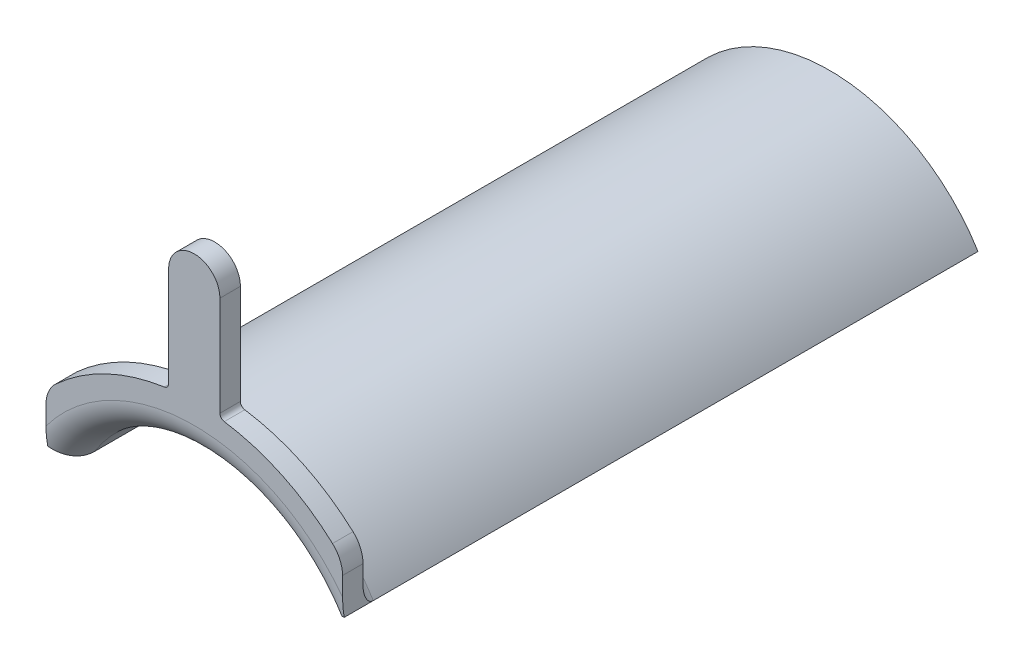
ISO-10303-21;
HEADER;
FILE_DESCRIPTION(('STEP AP214'),'2;1');
FILE_NAME('part.step','',(''),(''),'','','');
FILE_SCHEMA(('AUTOMOTIVE_DESIGN { 1 0 10303 214 1 1 1 1 }'));
ENDSEC;
DATA;
#1=APPLICATION_CONTEXT('core data for automotive mechanical design processes');
#2=APPLICATION_PROTOCOL_DEFINITION('international standard','automotive_design',2000,#1);
#3=PRODUCT_CONTEXT('',#1,'mechanical');
#4=PRODUCT('Part','Part','',(#3));
#5=PRODUCT_RELATED_PRODUCT_CATEGORY('part','',(#4));
#6=PRODUCT_DEFINITION_FORMATION('','',#4);
#7=PRODUCT_DEFINITION_CONTEXT('part definition',#1,'design');
#8=PRODUCT_DEFINITION('design','',#6,#7);
#9=PRODUCT_DEFINITION_SHAPE('','',#8);
#10=(LENGTH_UNIT() NAMED_UNIT(*) SI_UNIT(.MILLI.,.METRE.));
#11=(NAMED_UNIT(*) PLANE_ANGLE_UNIT() SI_UNIT($,.RADIAN.));
#12=(NAMED_UNIT(*) SI_UNIT($,.STERADIAN.) SOLID_ANGLE_UNIT());
#13=UNCERTAINTY_MEASURE_WITH_UNIT(LENGTH_MEASURE(1.E-05),#10,'distance_accuracy_value','');
#14=(GEOMETRIC_REPRESENTATION_CONTEXT(3) GLOBAL_UNCERTAINTY_ASSIGNED_CONTEXT((#13)) GLOBAL_UNIT_ASSIGNED_CONTEXT((#10,
#11,#12)) REPRESENTATION_CONTEXT('',''));
#15=CARTESIAN_POINT('',(0.,0.,0.));
#16=DIRECTION('',(0.,0.,1.));
#17=DIRECTION('',(1.,0.,0.));
#18=AXIS2_PLACEMENT_3D('',#15,#16,#17);
#19=CARTESIAN_POINT('',(0.,0.,6.2));
#20=DIRECTION('',(0.,0.,-1.));
#21=DIRECTION('',(-1.,0.,0.));
#22=AXIS2_PLACEMENT_3D('',#19,#20,#21);
#23=CYLINDRICAL_SURFACE('',#22,2.);
#24=CARTESIAN_POINT('',(0.,0.,6.));
#25=DIRECTION('',(0.,0.,1.));
#26=DIRECTION('',(1.,0.,0.));
#27=AXIS2_PLACEMENT_3D('',#24,#25,#26);
#28=CIRCLE('',#27,2.);
#29=CARTESIAN_POINT('',(-0.292682926829268,1.9784682722608,6.));
#30=VERTEX_POINT('',#29);
#31=CARTESIAN_POINT('',(-1.34894854738371,1.47659670069771,6.));
#32=VERTEX_POINT('',#31);
#33=EDGE_CURVE('E203',#30,#32,#28,.T.);
#34=ORIENTED_EDGE('',*,*,#33,.T.);
#35=DIRECTION('',(0.,0.,-1.));
#36=VECTOR('',#35,1.);
#37=CARTESIAN_POINT('',(-1.34894854738371,1.47659670069771,6.2));
#38=LINE('',#37,#36);
#39=CARTESIAN_POINT('',(-1.34894854738371,1.47659670069771,6.2));
#40=VERTEX_POINT('',#39);
#41=EDGE_CURVE('E372',#32,#40,#38,.F.);
#42=ORIENTED_EDGE('',*,*,#41,.T.);
#43=CARTESIAN_POINT('',(0.,0.,6.2));
#44=DIRECTION('',(0.,0.,1.));
#45=DIRECTION('',(1.,0.,0.));
#46=AXIS2_PLACEMENT_3D('',#43,#44,#45);
#47=CIRCLE('',#46,2.);
#48=CARTESIAN_POINT('',(-0.292682926829268,1.9784682722608,6.2));
#49=VERTEX_POINT('',#48);
#50=EDGE_CURVE('E195',#49,#40,#47,.T.);
#51=ORIENTED_EDGE('',*,*,#50,.F.);
#52=DIRECTION('',(0.,0.,-1.));
#53=VECTOR('',#52,1.);
#54=CARTESIAN_POINT('',(-0.292682926829268,1.9784682722608,6.2));
#55=LINE('',#54,#53);
#56=EDGE_CURVE('E237',#49,#30,#55,.T.);
#57=ORIENTED_EDGE('',*,*,#56,.T.);
#58=EDGE_LOOP('',(#34,#42,#51,#57));
#59=FACE_BOUND('',#58,.T.);
#60=ADVANCED_FACE('F37',(#59),#23,.T.);
#61=CARTESIAN_POINT('',(0.,0.,6.));
#62=DIRECTION('',(0.,0.,-1.));
#63=DIRECTION('',(-1.,0.,0.));
#64=AXIS2_PLACEMENT_3D('',#61,#62,#63);
#65=CYLINDRICAL_SURFACE('',#64,1.5);
#66=DIRECTION('',(0.,0.,-1.));
#67=VECTOR('',#66,1.);
#68=CARTESIAN_POINT('',(1.27331621725987,0.792884487717485,6.));
#69=LINE('',#68,#67);
#70=CARTESIAN_POINT('',(1.27331621725987,0.792884487717485,5.9));
#71=VERTEX_POINT('',#70);
#72=CARTESIAN_POINT('',(1.27331621725987,0.792884487717485,0.));
#73=VERTEX_POINT('',#72);
#74=EDGE_CURVE('E228',#71,#73,#69,.T.);
#75=ORIENTED_EDGE('',*,*,#74,.F.);
#76=CARTESIAN_POINT('',(0.,0.,5.9));
#77=DIRECTION('',(0.,0.,-1.));
#78=DIRECTION('',(-1.,0.,0.));
#79=AXIS2_PLACEMENT_3D('',#76,#77,#78);
#80=CIRCLE('',#79,1.5);
#81=CARTESIAN_POINT('',(-1.27331621725989,0.792884487717454,5.9));
#82=VERTEX_POINT('',#81);
#83=EDGE_CURVE('E313',#71,#82,#80,.F.);
#84=ORIENTED_EDGE('',*,*,#83,.T.);
#85=DIRECTION('',(0.,0.,-1.));
#86=VECTOR('',#85,1.);
#87=CARTESIAN_POINT('',(-1.27331621725989,0.792884487717454,6.));
#88=LINE('',#87,#86);
#89=CARTESIAN_POINT('',(-1.27331621725989,0.792884487717454,0.));
#90=VERTEX_POINT('',#89);
#91=EDGE_CURVE('E222',#82,#90,#88,.T.);
#92=ORIENTED_EDGE('',*,*,#91,.T.);
#93=CARTESIAN_POINT('',(0.,0.,0.));
#94=DIRECTION('',(0.,0.,-1.));
#95=DIRECTION('',(1.,0.,0.));
#96=AXIS2_PLACEMENT_3D('',#93,#94,#95);
#97=CIRCLE('',#96,1.5);
#98=EDGE_CURVE('E210',#90,#73,#97,.T.);
#99=ORIENTED_EDGE('',*,*,#98,.T.);
#100=EDGE_LOOP('',(#75,#84,#92,#99));
#101=FACE_BOUND('',#100,.T.);
#102=ADVANCED_FACE('F333',(#101),#65,.F.);
#103=CARTESIAN_POINT('',(1.27331621725987,0.792884487717485,6.));
#104=DIRECTION('',(-0.50000000000001,0.866025403784433,0.));
#105=DIRECTION('',(-0.866025403784433,-0.50000000000001,0.));
#106=AXIS2_PLACEMENT_3D('',#103,#104,#105);
#107=PLANE('',#106);
#108=DIRECTION('',(0.,0.,-1.));
#109=VECTOR('',#108,1.);
#110=CARTESIAN_POINT('',(1.44660626527613,0.892933543587561,6.2));
#111=LINE('',#110,#109);
#112=CARTESIAN_POINT('',(1.44660626527613,0.892933543587561,6.18284271247462));
#113=VERTEX_POINT('',#112);
#114=CARTESIAN_POINT('',(1.44660626527613,0.892933543587561,5.9));
#115=VERTEX_POINT('',#114);
#116=EDGE_CURVE('E208',#113,#115,#111,.T.);
#117=ORIENTED_EDGE('',*,*,#116,.F.);
#118=CARTESIAN_POINT('',(1.44660626527613,0.892933543587561,6.18284271247462));
#119=CARTESIAN_POINT('',(1.4328147401655,0.884971002852402,6.17722998739368));
#120=CARTESIAN_POINT('',(1.41944568748765,0.877252376690036,6.17024937129352));
#121=CARTESIAN_POINT('',(1.39391383538445,0.86251155500534,6.15381115512487));
#122=CARTESIAN_POINT('',(1.38175026359922,0.85548891356083,6.14435515538179));
#123=CARTESIAN_POINT('',(1.35896731468497,0.842335171872252,6.12321274352385));
#124=CARTESIAN_POINT('',(1.34834857259774,0.836204438269739,6.11152541870495));
#125=CARTESIAN_POINT('',(1.32896271162032,0.825012006215953,6.08625960460518));
#126=CARTESIAN_POINT('',(1.3201953241371,0.819950152692426,6.07268139012805));
#127=CARTESIAN_POINT('',(1.30476091697719,0.811039093563866,6.04401947019763));
#128=CARTESIAN_POINT('',(1.29809379669494,0.80718982987419,6.02893583690147));
#129=CARTESIAN_POINT('',(1.28705048293011,0.80081396969932,5.99768934293768));
#130=CARTESIAN_POINT('',(1.28267343086918,0.798286877513685,5.98152688930104));
#131=CARTESIAN_POINT('',(1.27744695382671,0.795269369586304,5.95438334004591));
#132=CARTESIAN_POINT('',(1.2758985860467,0.79437541903171,5.94357485730428));
#133=CARTESIAN_POINT('',(1.27383352413859,0.793183154983166,5.92184575174497));
#134=CARTESIAN_POINT('',(1.27331509536916,0.792883839993579,5.91092534866764));
#135=CARTESIAN_POINT('',(1.27331621725884,0.792884487716891,5.90000000000026));
#136=B_SPLINE_CURVE_WITH_KNOTS('',3,(#118,#119,#120,#121,#122,#123,#124,#125,#126,#127,#128,
#129,#130,#131,#132,#133,#134,#135),.UNSPECIFIED.,.F.,.F.,(4,2,2,2,2,2,2,2,4),(0.,
0.0505886132530566,0.101144601599428,0.151721313909541,0.202290683542296,0.252857630467479,
0.303405605532996,0.336210920827148,0.368960937835434),.UNSPECIFIED.);
#137=EDGE_CURVE('E298',#113,#71,#136,.T.);
#138=ORIENTED_EDGE('',*,*,#137,.T.);
#139=ORIENTED_EDGE('',*,*,#74,.T.);
#140=DIRECTION('',(0.866025403784433,0.50000000000001,0.));
#141=VECTOR('',#140,1.);
#142=CARTESIAN_POINT('',(1.27331621725987,0.792884487717485,0.));
#143=LINE('',#142,#141);
#144=CARTESIAN_POINT('',(1.44660626527613,0.892933543587561,0.));
#145=VERTEX_POINT('',#144);
#146=EDGE_CURVE('E213',#73,#145,#143,.T.);
#147=ORIENTED_EDGE('',*,*,#146,.T.);
#148=DIRECTION('',(0.,0.,-1.));
#149=VECTOR('',#148,1.);
#150=CARTESIAN_POINT('',(1.44660626527613,0.892933543587561,6.));
#151=LINE('',#150,#149);
#152=EDGE_CURVE('E226',#115,#145,#151,.T.);
#153=ORIENTED_EDGE('',*,*,#152,.F.);
#154=EDGE_LOOP('',(#117,#138,#139,#147,#153));
#155=FACE_BOUND('',#154,.T.);
#156=ADVANCED_FACE('F328',(#155),#107,.F.);
#157=CARTESIAN_POINT('',(0.,0.,6.));
#158=DIRECTION('',(0.,0.,-1.));
#159=DIRECTION('',(-1.,0.,0.));
#160=AXIS2_PLACEMENT_3D('',#157,#158,#159);
#161=CYLINDRICAL_SURFACE('',#160,1.7);
#162=DIRECTION('',(0.,0.,-1.));
#163=VECTOR('',#162,1.);
#164=CARTESIAN_POINT('',(-1.44660626527616,0.892933543587527,6.));
#165=LINE('',#164,#163);
#166=CARTESIAN_POINT('',(-1.44660626527616,0.892933543587527,5.9));
#167=VERTEX_POINT('',#166);
#168=CARTESIAN_POINT('',(-1.44660626527616,0.892933543587527,0.));
#169=VERTEX_POINT('',#168);
#170=EDGE_CURVE('E224',#167,#169,#165,.T.);
#171=ORIENTED_EDGE('',*,*,#170,.F.);
#172=CARTESIAN_POINT('',(0.,0.,5.9));
#173=DIRECTION('',(0.,0.,-1.));
#174=DIRECTION('',(-1.,0.,0.));
#175=AXIS2_PLACEMENT_3D('',#172,#173,#174);
#176=CIRCLE('',#175,1.7);
#177=EDGE_CURVE('E250',#167,#115,#176,.T.);
#178=ORIENTED_EDGE('',*,*,#177,.T.);
#179=ORIENTED_EDGE('',*,*,#152,.T.);
#180=CARTESIAN_POINT('',(0.,0.,0.));
#181=DIRECTION('',(0.,0.,1.));
#182=DIRECTION('',(1.,0.,0.));
#183=AXIS2_PLACEMENT_3D('',#180,#181,#182);
#184=CIRCLE('',#183,1.7);
#185=EDGE_CURVE('E216',#145,#169,#184,.T.);
#186=ORIENTED_EDGE('',*,*,#185,.T.);
#187=EDGE_LOOP('',(#171,#178,#179,#186));
#188=FACE_BOUND('',#187,.T.);
#189=ADVANCED_FACE('F325',(#188),#161,.T.);
#190=CARTESIAN_POINT('',(-1.27331621725989,0.792884487717454,6.));
#191=DIRECTION('',(0.49999999999999,0.866025403784444,0.));
#192=DIRECTION('',(-0.866025403784444,0.49999999999999,0.));
#193=AXIS2_PLACEMENT_3D('',#190,#191,#192);
#194=PLANE('',#193);
#195=ORIENTED_EDGE('',*,*,#91,.F.);
#196=CARTESIAN_POINT('',(-1.27331621725989,0.792884487717454,5.9));
#197=CARTESIAN_POINT('',(-1.27330373750125,0.792877282525443,5.91687004244893));
#198=CARTESIAN_POINT('',(-1.27454849192226,0.793595941825491,5.93373576867481));
#199=CARTESIAN_POINT('',(-1.27946073120027,0.796432024494975,5.96697888603776));
#200=CARTESIAN_POINT('',(-1.28312656557469,0.798548494957851,5.98335660191433));
#201=CARTESIAN_POINT('',(-1.29279137008963,0.804128472446216,6.01517454918392));
#202=CARTESIAN_POINT('',(-1.29879126389518,0.807592512749959,6.03061440663504));
#203=CARTESIAN_POINT('',(-1.31294883592552,0.815766390772744,6.06011060903929));
#204=CARTESIAN_POINT('',(-1.32110622064483,0.820476059036325,6.07416714182355));
#205=CARTESIAN_POINT('',(-1.33935155059416,0.831010005194022,6.10050670323699));
#206=CARTESIAN_POINT('',(-1.34944050845412,0.836834867730311,6.11278879566091));
#207=CARTESIAN_POINT('',(-1.37126118249777,0.84943303976331,6.13522208157759));
#208=CARTESIAN_POINT('',(-1.38299230145908,0.85620600445352,6.14537404641745));
#209=CARTESIAN_POINT('',(-1.40343162705984,0.868006654591174,6.16013698761019));
#210=CARTESIAN_POINT('',(-1.41176842302582,0.872819905986309,6.16544598229833));
#211=CARTESIAN_POINT('',(-1.4288800413184,0.882699303413801,6.17497206123606));
#212=CARTESIAN_POINT('',(-1.437654099352,0.887765008181383,6.17919097615287));
#213=CARTESIAN_POINT('',(-1.44660626527558,0.892933543587192,6.18284271247569));
#214=B_SPLINE_CURVE_WITH_KNOTS('',3,(#196,#197,#198,#199,#200,#201,#202,#203,#204,#205,#206,
#207,#208,#209,#210,#211,#212,#213),.UNSPECIFIED.,.F.,.F.,(4,2,2,2,2,2,2,2,4),(0.,
0.0505428322841524,0.10105124436,0.151579664662545,0.202101214601808,0.252649323421911,
0.303179096399212,0.336098019703816,0.368961294653621),.UNSPECIFIED.);
#215=CARTESIAN_POINT('',(-1.44660626527616,0.892933543587527,6.18284271247462));
#216=VERTEX_POINT('',#215);
#217=EDGE_CURVE('E306',#82,#216,#214,.T.);
#218=ORIENTED_EDGE('',*,*,#217,.T.);
#219=DIRECTION('',(0.,0.,-1.));
#220=VECTOR('',#219,1.);
#221=CARTESIAN_POINT('',(-1.44660626527616,0.892933543587527,6.2));
#222=LINE('',#221,#220);
#223=EDGE_CURVE('E201',#216,#167,#222,.T.);
#224=ORIENTED_EDGE('',*,*,#223,.T.);
#225=ORIENTED_EDGE('',*,*,#170,.T.);
#226=DIRECTION('',(0.866025403784444,-0.49999999999999,0.));
#227=VECTOR('',#226,1.);
#228=CARTESIAN_POINT('',(-1.27331621725989,0.792884487717454,0.));
#229=LINE('',#228,#227);
#230=EDGE_CURVE('E219',#169,#90,#229,.T.);
#231=ORIENTED_EDGE('',*,*,#230,.T.);
#232=EDGE_LOOP('',(#195,#218,#224,#225,#231));
#233=FACE_BOUND('',#232,.T.);
#234=ADVANCED_FACE('F319',(#233),#194,.F.);
#235=CARTESIAN_POINT('',(0.,0.,0.));
#236=DIRECTION('',(0.,0.,1.));
#237=DIRECTION('',(1.,0.,0.));
#238=AXIS2_PLACEMENT_3D('',#235,#236,#237);
#239=PLANE('',#238);
#240=ORIENTED_EDGE('',*,*,#98,.F.);
#241=ORIENTED_EDGE('',*,*,#230,.F.);
#242=ORIENTED_EDGE('',*,*,#185,.F.);
#243=ORIENTED_EDGE('',*,*,#146,.F.);
#244=EDGE_LOOP('',(#240,#241,#242,#243));
#245=FACE_BOUND('',#244,.T.);
#246=ADVANCED_FACE('F324',(#245),#239,.F.);
#247=CARTESIAN_POINT('',(1.44660626527613,0.892933543587561,6.2));
#248=DIRECTION('',(-1.,0.,0.));
#249=DIRECTION('',(0.,0.,1.));
#250=AXIS2_PLACEMENT_3D('',#247,#248,#249);
#251=PLANE('',#250);
#252=DIRECTION('',(0.,1.,0.));
#253=VECTOR('',#252,1.);
#254=CARTESIAN_POINT('',(1.44660626527613,0.892933543587561,6.));
#255=LINE('',#254,#253);
#256=CARTESIAN_POINT('',(1.44660626527613,1.07113505836745,6.));
#257=VERTEX_POINT('',#256);
#258=CARTESIAN_POINT('',(1.44660626527613,1.25510719559307,6.));
#259=VERTEX_POINT('',#258);
#260=EDGE_CURVE('E191',#257,#259,#255,.T.);
#261=ORIENTED_EDGE('',*,*,#260,.T.);
#262=DIRECTION('',(0.,0.,-1.));
#263=VECTOR('',#262,1.);
#264=CARTESIAN_POINT('',(1.44660626527613,1.25510719559307,6.2));
#265=LINE('',#264,#263);
#266=CARTESIAN_POINT('',(1.44660626527613,1.25510719559307,6.2));
#267=VERTEX_POINT('',#266);
#268=EDGE_CURVE('E11',#259,#267,#265,.F.);
#269=ORIENTED_EDGE('',*,*,#268,.T.);
#270=DIRECTION('',(0.,1.,0.));
#271=VECTOR('',#270,1.);
#272=CARTESIAN_POINT('',(1.44660626527613,0.892933543587561,6.2));
#273=LINE('',#272,#271);
#274=CARTESIAN_POINT('',(1.44660626527613,1.07113505836745,6.2));
#275=VERTEX_POINT('',#274);
#276=EDGE_CURVE('E193',#275,#267,#273,.T.);
#277=ORIENTED_EDGE('',*,*,#276,.F.);
#278=CARTESIAN_POINT('',(1.44660626527613,1.07113505836745,6.2));
#279=CARTESIAN_POINT('',(1.44660626527613,1.05617537048115,6.19999875559178));
#280=CARTESIAN_POINT('',(1.44660626527613,1.04121857096354,6.19960384248165));
#281=CARTESIAN_POINT('',(1.44660626527613,1.01137306073666,6.19808315338463));
#282=CARTESIAN_POINT('',(1.44660626527613,0.996484273062909,6.19695890553441));
#283=CARTESIAN_POINT('',(1.44660626527613,0.966779549155292,6.19403606664698));
#284=CARTESIAN_POINT('',(1.44660626527613,0.951963589257468,6.19223771165764));
#285=CARTESIAN_POINT('',(1.44660626527613,0.922390687007565,6.18800615932051));
#286=CARTESIAN_POINT('',(1.44660626527613,0.907633932893042,6.18557164210894));
#287=CARTESIAN_POINT('',(1.44660626527613,0.892933543587561,6.18284271247462));
#288=B_SPLINE_CURVE_WITH_KNOTS('',3,(#278,#279,#280,#281,#282,#283,#284,#285,#286,#287),
.UNSPECIFIED.,.F.,.F.,(4,2,2,2,4),(0.,0.0448697691531664,0.0896458273634387,0.134406221246566,
0.179260228472806),.UNSPECIFIED.);
#289=EDGE_CURVE('E290',#275,#113,#288,.T.);
#290=ORIENTED_EDGE('',*,*,#289,.T.);
#291=ORIENTED_EDGE('',*,*,#116,.T.);
#292=CARTESIAN_POINT('',(1.44660626527613,0.892933543587561,5.9));
#293=CARTESIAN_POINT('',(1.44660626527613,0.892925621042267,5.90318326045763));
#294=CARTESIAN_POINT('',(1.44660626527613,0.893222525979096,5.9063563857614));
#295=CARTESIAN_POINT('',(1.44660626527613,0.894353090936536,5.91257215925096));
#296=CARTESIAN_POINT('',(1.44660626527613,0.895181011470659,5.91561583588195));
#297=CARTESIAN_POINT('',(1.44660626527613,0.897554815938305,5.92223434636256));
#298=CARTESIAN_POINT('',(1.44660626527613,0.899224319797246,5.92576419915769));
#299=CARTESIAN_POINT('',(1.44660626527613,0.903113470989085,5.93251709761274));
#300=CARTESIAN_POINT('',(1.44660626527613,0.905335538728006,5.93573870471407));
#301=CARTESIAN_POINT('',(1.44660626527613,0.911488833122282,5.9435095559544));
#302=CARTESIAN_POINT('',(1.44660626527613,0.915695795584312,5.94783862856842));
#303=CARTESIAN_POINT('',(1.44660626527613,0.924703182050116,5.95581629899054));
#304=CARTESIAN_POINT('',(1.44660626527613,0.929504789969755,5.95946350180282));
#305=CARTESIAN_POINT('',(1.44660626527613,0.943253830633011,5.96870700067155));
#306=CARTESIAN_POINT('',(1.44660626527613,0.952601833201071,5.97370448192435));
#307=CARTESIAN_POINT('',(1.44660626527613,0.971932576408412,5.98229204095762));
#308=CARTESIAN_POINT('',(1.44660626527613,0.981917673711333,5.98587649364217));
#309=CARTESIAN_POINT('',(1.44660626527613,1.00497821616642,5.99261812210492));
#310=CARTESIAN_POINT('',(1.44660626527613,1.01816289261015,5.99540146034732));
#311=CARTESIAN_POINT('',(1.44660626527613,1.04461990732344,5.99906366295796));
#312=CARTESIAN_POINT('',(1.44660626527613,1.05788880454666,5.99996712510121));
#313=CARTESIAN_POINT('',(1.44660626527613,1.07113505836745,6.));
#314=B_SPLINE_CURVE_WITH_KNOTS('',3,(#292,#293,#294,#295,#296,#297,#298,#299,#300,#301,#302,
#303,#304,#305,#306,#307,#308,#309,#310,#311,#312,#313),.UNSPECIFIED.,.F.,.F.,(4,2,2,2,2,2,2,2,
2,2,4),(0.,0.00951955993228114,0.0189379229000706,0.0305874564215124,0.0422889463234112,
0.0602965757276051,0.0783406520691038,0.109964201082201,0.141712398185889,0.181994463019227,
0.221746043392919),.UNSPECIFIED.);
#315=EDGE_CURVE('E262',#115,#257,#314,.T.);
#316=ORIENTED_EDGE('',*,*,#315,.T.);
#317=EDGE_LOOP('',(#261,#269,#277,#290,#291,#316));
#318=FACE_BOUND('',#317,.T.);
#319=ADVANCED_FACE('F353',(#318),#251,.F.);
#320=CARTESIAN_POINT('',(1.34894854738369,1.47659670069774,6.2));
#321=VERTEX_POINT('',#320);
#322=CARTESIAN_POINT('',(0.292682926829268,1.9784682722608,6.2));
#323=VERTEX_POINT('',#322);
#324=EDGE_CURVE('E197',#321,#323,#47,.T.);
#325=ORIENTED_EDGE('',*,*,#324,.F.);
#326=DIRECTION('',(0.,0.,-1.));
#327=VECTOR('',#326,1.);
#328=CARTESIAN_POINT('',(1.34894854738369,1.47659670069774,6.2));
#329=LINE('',#328,#327);
#330=CARTESIAN_POINT('',(1.34894854738369,1.47659670069774,6.));
#331=VERTEX_POINT('',#330);
#332=EDGE_CURVE('E45',#321,#331,#329,.T.);
#333=ORIENTED_EDGE('',*,*,#332,.T.);
#334=CARTESIAN_POINT('',(0.292682926829268,1.9784682722608,6.));
#335=VERTEX_POINT('',#334);
#336=EDGE_CURVE('E204',#331,#335,#28,.T.);
#337=ORIENTED_EDGE('',*,*,#336,.T.);
#338=DIRECTION('',(0.,0.,-1.));
#339=VECTOR('',#338,1.);
#340=CARTESIAN_POINT('',(0.292682926829268,1.9784682722608,6.2));
#341=LINE('',#340,#339);
#342=EDGE_CURVE('E230',#335,#323,#341,.F.);
#343=ORIENTED_EDGE('',*,*,#342,.T.);
#344=EDGE_LOOP('',(#325,#333,#337,#343));
#345=FACE_BOUND('',#344,.T.);
#346=ADVANCED_FACE('F348',(#345),#23,.T.);
#347=CARTESIAN_POINT('',(-1.44660626527616,0.892933543587527,6.2));
#348=DIRECTION('',(1.,0.,0.));
#349=DIRECTION('',(0.,0.,-1.));
#350=AXIS2_PLACEMENT_3D('',#347,#348,#349);
#351=PLANE('',#350);
#352=DIRECTION('',(0.,-1.,0.));
#353=VECTOR('',#352,1.);
#354=CARTESIAN_POINT('',(-1.44660626527616,0.892933543587527,6.2));
#355=LINE('',#354,#353);
#356=CARTESIAN_POINT('',(-1.44660626527616,1.25510719559305,6.2));
#357=VERTEX_POINT('',#356);
#358=CARTESIAN_POINT('',(-1.44660626527616,1.07113505836742,6.2));
#359=VERTEX_POINT('',#358);
#360=EDGE_CURVE('E199',#357,#359,#355,.T.);
#361=ORIENTED_EDGE('',*,*,#360,.F.);
#362=DIRECTION('',(0.,0.,-1.));
#363=VECTOR('',#362,1.);
#364=CARTESIAN_POINT('',(-1.44660626527616,1.25510719559305,6.2));
#365=LINE('',#364,#363);
#366=CARTESIAN_POINT('',(-1.44660626527616,1.25510719559305,6.));
#367=VERTEX_POINT('',#366);
#368=EDGE_CURVE('E376',#357,#367,#365,.T.);
#369=ORIENTED_EDGE('',*,*,#368,.T.);
#370=DIRECTION('',(0.,-1.,0.));
#371=VECTOR('',#370,1.);
#372=CARTESIAN_POINT('',(-1.44660626527616,0.892933543587527,6.));
#373=LINE('',#372,#371);
#374=CARTESIAN_POINT('',(-1.44660626527616,1.07113505836742,6.));
#375=VERTEX_POINT('',#374);
#376=EDGE_CURVE('E196',#367,#375,#373,.T.);
#377=ORIENTED_EDGE('',*,*,#376,.T.);
#378=CARTESIAN_POINT('',(-1.44660626527616,1.07113505836742,6.));
#379=CARTESIAN_POINT('',(-1.44660626527616,1.06308815399082,5.99999667971218));
#380=CARTESIAN_POINT('',(-1.44660626527616,1.05505025487733,5.99965673305744));
#381=CARTESIAN_POINT('',(-1.44660626527616,1.03901381501151,5.99830567029279));
#382=CARTESIAN_POINT('',(-1.44660626527616,1.03101539459818,5.99729312578368));
#383=CARTESIAN_POINT('',(-1.44660626527616,1.00706260052502,5.99323489457301));
#384=CARTESIAN_POINT('',(-1.44660626527616,0.991253628549072,5.98916867021197));
#385=CARTESIAN_POINT('',(-1.44660626527616,0.968938900446216,5.98096084991716));
#386=CARTESIAN_POINT('',(-1.44660626527616,0.961977848137236,5.97802168844355));
#387=CARTESIAN_POINT('',(-1.44660626527616,0.948427265307756,5.97137746601117));
#388=CARTESIAN_POINT('',(-1.44660626527616,0.941837351938062,5.96767321340859));
#389=CARTESIAN_POINT('',(-1.44660626527616,0.930442346558945,5.96014826253803));
#390=CARTESIAN_POINT('',(-1.44660626527616,0.925535683805601,5.95648266728772));
#391=CARTESIAN_POINT('',(-1.44660626527616,0.916321870883123,5.9484535457278));
#392=CARTESIAN_POINT('',(-1.44660626527616,0.912013462516487,5.94409152695433));
#393=CARTESIAN_POINT('',(-1.44660626527616,0.905879814938178,5.93646760424404));
#394=CARTESIAN_POINT('',(-1.44660626527616,0.903747081246242,5.93345462898332));
#395=CARTESIAN_POINT('',(-1.44660626527616,0.899959253017242,5.92715185129367));
#396=CARTESIAN_POINT('',(-1.44660626527616,0.898302277344484,5.92386320745418));
#397=CARTESIAN_POINT('',(-1.44660626527616,0.895672394582398,5.91722295333213));
#398=CARTESIAN_POINT('',(-1.44660626527616,0.894667216528644,5.91388446834411));
#399=CARTESIAN_POINT('',(-1.44660626527616,0.893287951683112,5.90703686236769));
#400=CARTESIAN_POINT('',(-1.44660626527616,0.892922201568988,5.90352609209511));
#401=CARTESIAN_POINT('',(-1.44660626527616,0.892933543587528,5.9));
#402=B_SPLINE_CURVE_WITH_KNOTS('',3,(#378,#379,#380,#381,#382,#383,#384,#385,#386,#387,#388,
#389,#390,#391,#392,#393,#394,#395,#396,#397,#398,#399,#400,#401),.UNSPECIFIED.,.F.,.F.,(4,2,2,
2,2,2,2,2,2,2,2,4),(0.,0.0241159901893909,0.0482833600618087,0.0969236333931822,
0.119560536801187,0.142173644448488,0.160501331310774,0.178789869434001,0.189831955417781,
0.200829760304943,0.211230130943226,0.221765114762069),.UNSPECIFIED.);
#403=EDGE_CURVE('E253',#375,#167,#402,.T.);
#404=ORIENTED_EDGE('',*,*,#403,.T.);
#405=ORIENTED_EDGE('',*,*,#223,.F.);
#406=CARTESIAN_POINT('',(-1.44660626527616,0.892933543587527,6.18284271247462));
#407=CARTESIAN_POINT('',(-1.44660626527616,0.907633932893005,6.18557164210893));
#408=CARTESIAN_POINT('',(-1.44660626527616,0.922390687007524,6.18800615932051));
#409=CARTESIAN_POINT('',(-1.44660626527616,0.951963589257422,6.19223771165765));
#410=CARTESIAN_POINT('',(-1.44660626527616,0.966779549155245,6.19403606664699));
#411=CARTESIAN_POINT('',(-1.44660626527616,0.996484273062856,6.1969589055344));
#412=CARTESIAN_POINT('',(-1.44660626527616,1.0113730607366,6.19808315338459));
#413=CARTESIAN_POINT('',(-1.44660626527616,1.04121857096347,6.19960384248169));
#414=CARTESIAN_POINT('',(-1.44660626527616,1.05617537048107,6.19999875559192));
#415=CARTESIAN_POINT('',(-1.44660626527616,1.07113505836735,6.20000000000038));
#416=B_SPLINE_CURVE_WITH_KNOTS('',3,(#406,#407,#408,#409,#410,#411,#412,#413,#414,#415),
.UNSPECIFIED.,.F.,.F.,(4,2,2,2,4),(0.,0.0448540072262293,0.0896144011093529,0.134390459319608,
0.179260228472748),.UNSPECIFIED.);
#417=EDGE_CURVE('E312',#216,#359,#416,.T.);
#418=ORIENTED_EDGE('',*,*,#417,.T.);
#419=EDGE_LOOP('',(#361,#369,#377,#404,#405,#418));
#420=FACE_BOUND('',#419,.T.);
#421=ADVANCED_FACE('F269',(#420),#351,.F.);
#422=CARTESIAN_POINT('',(0.,0.,6.2));
#423=DIRECTION('',(0.,0.,-1.));
#424=DIRECTION('',(-1.,0.,0.));
#425=AXIS2_PLACEMENT_3D('',#422,#423,#424);
#426=PLANE('',#425);
#427=ORIENTED_EDGE('',*,*,#50,.T.);
#428=CARTESIAN_POINT('',(-1.14660626527616,1.25510719559305,6.2));
#429=DIRECTION('',(0.,0.,-1.));
#430=DIRECTION('',(-1.,0.,0.));
#431=AXIS2_PLACEMENT_3D('',#428,#429,#430);
#432=CIRCLE('',#431,0.3);
#433=EDGE_CURVE('E368',#40,#357,#432,.F.);
#434=ORIENTED_EDGE('',*,*,#433,.T.);
#435=ORIENTED_EDGE('',*,*,#360,.T.);
#436=CARTESIAN_POINT('',(0.,0.,6.2));
#437=DIRECTION('',(0.,0.,-1.));
#438=DIRECTION('',(-1.,0.,0.));
#439=AXIS2_PLACEMENT_3D('',#436,#437,#438);
#440=CIRCLE('',#439,1.8);
#441=EDGE_CURVE('E386',#359,#275,#440,.T.);
#442=ORIENTED_EDGE('',*,*,#441,.T.);
#443=ORIENTED_EDGE('',*,*,#276,.T.);
#444=CARTESIAN_POINT('',(1.14660626527613,1.25510719559307,6.2));
#445=DIRECTION('',(0.,0.,-1.));
#446=DIRECTION('',(-1.,0.,0.));
#447=AXIS2_PLACEMENT_3D('',#444,#445,#446);
#448=CIRCLE('',#447,0.3);
#449=EDGE_CURVE('E52',#267,#321,#448,.F.);
#450=ORIENTED_EDGE('',*,*,#449,.T.);
#451=ORIENTED_EDGE('',*,*,#324,.T.);
#452=CARTESIAN_POINT('',(0.3,2.02792997906732,6.2));
#453=DIRECTION('',(0.,0.,-1.));
#454=DIRECTION('',(-1.,0.,0.));
#455=AXIS2_PLACEMENT_3D('',#452,#453,#454);
#456=CIRCLE('',#455,0.05);
#457=CARTESIAN_POINT('',(0.25,2.02792997906732,6.2));
#458=VERTEX_POINT('',#457);
#459=EDGE_CURVE('E239',#323,#458,#456,.T.);
#460=ORIENTED_EDGE('',*,*,#459,.T.);
#461=DIRECTION('',(0.,1.,0.));
#462=VECTOR('',#461,1.);
#463=CARTESIAN_POINT('',(0.25,1.98431348329844,6.2));
#464=LINE('',#463,#462);
#465=CARTESIAN_POINT('',(0.25,3.,6.2));
#466=VERTEX_POINT('',#465);
#467=EDGE_CURVE('E186',#458,#466,#464,.T.);
#468=ORIENTED_EDGE('',*,*,#467,.T.);
#469=CARTESIAN_POINT('',(0.,3.,6.2));
#470=DIRECTION('',(0.,0.,1.));
#471=DIRECTION('',(-1.,0.,0.));
#472=AXIS2_PLACEMENT_3D('',#469,#470,#471);
#473=CIRCLE('',#472,0.25);
#474=CARTESIAN_POINT('',(-0.25,3.,6.2));
#475=VERTEX_POINT('',#474);
#476=EDGE_CURVE('E176',#466,#475,#473,.T.);
#477=ORIENTED_EDGE('',*,*,#476,.T.);
#478=DIRECTION('',(0.,-1.,0.));
#479=VECTOR('',#478,1.);
#480=CARTESIAN_POINT('',(-0.25,1.98431348329844,6.2));
#481=LINE('',#480,#479);
#482=CARTESIAN_POINT('',(-0.25,2.02792997906732,6.2));
#483=VERTEX_POINT('',#482);
#484=EDGE_CURVE('E169',#475,#483,#481,.T.);
#485=ORIENTED_EDGE('',*,*,#484,.T.);
#486=CARTESIAN_POINT('',(-0.3,2.02792997906732,6.2));
#487=DIRECTION('',(0.,0.,-1.));
#488=DIRECTION('',(-1.,0.,0.));
#489=AXIS2_PLACEMENT_3D('',#486,#487,#488);
#490=CIRCLE('',#489,0.05);
#491=EDGE_CURVE('E243',#483,#49,#490,.T.);
#492=ORIENTED_EDGE('',*,*,#491,.T.);
#493=EDGE_LOOP('',(#427,#434,#435,#442,#443,#450,#451,#460,#468,#477,#485,#492));
#494=FACE_BOUND('',#493,.T.);
#495=ADVANCED_FACE('F359',(#494),#426,.F.);
#496=CARTESIAN_POINT('',(0.,0.,6.));
#497=DIRECTION('',(0.,0.,-1.));
#498=DIRECTION('',(-1.,0.,0.));
#499=AXIS2_PLACEMENT_3D('',#496,#497,#498);
#500=PLANE('',#499);
#501=ORIENTED_EDGE('',*,*,#376,.F.);
#502=CARTESIAN_POINT('',(-1.14660626527616,1.25510719559305,6.));
#503=DIRECTION('',(0.,0.,-1.));
#504=DIRECTION('',(-1.,0.,0.));
#505=AXIS2_PLACEMENT_3D('',#502,#503,#504);
#506=CIRCLE('',#505,0.3);
#507=EDGE_CURVE('E374',#367,#32,#506,.T.);
#508=ORIENTED_EDGE('',*,*,#507,.T.);
#509=ORIENTED_EDGE('',*,*,#33,.F.);
#510=CARTESIAN_POINT('',(-0.3,2.02792997906732,6.));
#511=DIRECTION('',(0.,0.,-1.));
#512=DIRECTION('',(-1.,0.,0.));
#513=AXIS2_PLACEMENT_3D('',#510,#511,#512);
#514=CIRCLE('',#513,0.05);
#515=CARTESIAN_POINT('',(-0.25,2.02792997906732,6.));
#516=VERTEX_POINT('',#515);
#517=EDGE_CURVE('E245',#30,#516,#514,.F.);
#518=ORIENTED_EDGE('',*,*,#517,.T.);
#519=DIRECTION('',(0.,-1.,0.));
#520=VECTOR('',#519,1.);
#521=CARTESIAN_POINT('',(-0.25,1.98431348329844,6.));
#522=LINE('',#521,#520);
#523=CARTESIAN_POINT('',(-0.25,3.,6.));
#524=VERTEX_POINT('',#523);
#525=EDGE_CURVE('E178',#524,#516,#522,.T.);
#526=ORIENTED_EDGE('',*,*,#525,.F.);
#527=CARTESIAN_POINT('',(0.,3.,6.));
#528=DIRECTION('',(0.,0.,1.));
#529=DIRECTION('',(-1.,0.,0.));
#530=AXIS2_PLACEMENT_3D('',#527,#528,#529);
#531=CIRCLE('',#530,0.25);
#532=CARTESIAN_POINT('',(0.25,3.,6.));
#533=VERTEX_POINT('',#532);
#534=EDGE_CURVE('E168',#533,#524,#531,.T.);
#535=ORIENTED_EDGE('',*,*,#534,.F.);
#536=DIRECTION('',(0.,1.,0.));
#537=VECTOR('',#536,1.);
#538=CARTESIAN_POINT('',(0.25,1.98431348329844,6.));
#539=LINE('',#538,#537);
#540=CARTESIAN_POINT('',(0.25,2.02792997906732,6.));
#541=VERTEX_POINT('',#540);
#542=EDGE_CURVE('E156',#541,#533,#539,.T.);
#543=ORIENTED_EDGE('',*,*,#542,.F.);
#544=CARTESIAN_POINT('',(0.3,2.02792997906732,6.));
#545=DIRECTION('',(0.,0.,-1.));
#546=DIRECTION('',(-1.,0.,0.));
#547=AXIS2_PLACEMENT_3D('',#544,#545,#546);
#548=CIRCLE('',#547,0.05);
#549=EDGE_CURVE('E241',#541,#335,#548,.F.);
#550=ORIENTED_EDGE('',*,*,#549,.T.);
#551=ORIENTED_EDGE('',*,*,#336,.F.);
#552=CARTESIAN_POINT('',(1.14660626527613,1.25510719559307,6.));
#553=DIRECTION('',(0.,0.,-1.));
#554=DIRECTION('',(-1.,0.,0.));
#555=AXIS2_PLACEMENT_3D('',#552,#553,#554);
#556=CIRCLE('',#555,0.3);
#557=EDGE_CURVE('E367',#331,#259,#556,.T.);
#558=ORIENTED_EDGE('',*,*,#557,.T.);
#559=ORIENTED_EDGE('',*,*,#260,.F.);
#560=CARTESIAN_POINT('',(0.,0.,6.));
#561=DIRECTION('',(0.,0.,-1.));
#562=DIRECTION('',(-1.,0.,0.));
#563=AXIS2_PLACEMENT_3D('',#560,#561,#562);
#564=CIRCLE('',#563,1.8);
#565=EDGE_CURVE('E247',#257,#375,#564,.F.);
#566=ORIENTED_EDGE('',*,*,#565,.T.);
#567=EDGE_LOOP('',(#501,#508,#509,#518,#526,#535,#543,#550,#551,#558,#559,#566));
#568=FACE_BOUND('',#567,.T.);
#569=ADVANCED_FACE('F181',(#568),#500,.T.);
#570=CARTESIAN_POINT('',(-0.25,1.98431348329844,6.));
#571=DIRECTION('',(-1.,0.,0.));
#572=DIRECTION('',(0.,0.,1.));
#573=AXIS2_PLACEMENT_3D('',#570,#571,#572);
#574=PLANE('',#573);
#575=ORIENTED_EDGE('',*,*,#525,.T.);
#576=DIRECTION('',(0.,0.,-1.));
#577=VECTOR('',#576,1.);
#578=CARTESIAN_POINT('',(-0.25,2.02792997906732,6.));
#579=LINE('',#578,#577);
#580=EDGE_CURVE('E234',#516,#483,#579,.F.);
#581=ORIENTED_EDGE('',*,*,#580,.T.);
#582=ORIENTED_EDGE('',*,*,#484,.F.);
#583=DIRECTION('',(0.,0.,1.));
#584=VECTOR('',#583,1.);
#585=CARTESIAN_POINT('',(-0.25,3.,6.));
#586=LINE('',#585,#584);
#587=EDGE_CURVE('E177',#524,#475,#586,.T.);
#588=ORIENTED_EDGE('',*,*,#587,.F.);
#589=EDGE_LOOP('',(#575,#581,#582,#588));
#590=FACE_BOUND('',#589,.T.);
#591=ADVANCED_FACE('F404',(#590),#574,.T.);
#592=CARTESIAN_POINT('',(0.,3.,6.));
#593=DIRECTION('',(0.,0.,1.));
#594=DIRECTION('',(1.,0.,0.));
#595=AXIS2_PLACEMENT_3D('',#592,#593,#594);
#596=CYLINDRICAL_SURFACE('',#595,0.25);
#597=ORIENTED_EDGE('',*,*,#476,.F.);
#598=DIRECTION('',(0.,0.,1.));
#599=VECTOR('',#598,1.);
#600=CARTESIAN_POINT('',(0.25,3.,6.));
#601=LINE('',#600,#599);
#602=EDGE_CURVE('E160',#533,#466,#601,.T.);
#603=ORIENTED_EDGE('',*,*,#602,.F.);
#604=ORIENTED_EDGE('',*,*,#534,.T.);
#605=ORIENTED_EDGE('',*,*,#587,.T.);
#606=EDGE_LOOP('',(#597,#603,#604,#605));
#607=FACE_BOUND('',#606,.T.);
#608=ADVANCED_FACE('F173',(#607),#596,.T.);
#609=CARTESIAN_POINT('',(0.25,1.98431348329844,6.));
#610=DIRECTION('',(1.,0.,0.));
#611=DIRECTION('',(0.,0.,-1.));
#612=AXIS2_PLACEMENT_3D('',#609,#610,#611);
#613=PLANE('',#612);
#614=ORIENTED_EDGE('',*,*,#467,.F.);
#615=DIRECTION('',(0.,0.,-1.));
#616=VECTOR('',#615,1.);
#617=CARTESIAN_POINT('',(0.25,2.02792997906732,6.));
#618=LINE('',#617,#616);
#619=EDGE_CURVE('E163',#458,#541,#618,.T.);
#620=ORIENTED_EDGE('',*,*,#619,.T.);
#621=ORIENTED_EDGE('',*,*,#542,.T.);
#622=ORIENTED_EDGE('',*,*,#602,.T.);
#623=EDGE_LOOP('',(#614,#620,#621,#622));
#624=FACE_BOUND('',#623,.T.);
#625=ADVANCED_FACE('F159',(#624),#613,.T.);
#626=CARTESIAN_POINT('',(0.3,2.02792997906732,6.2));
#627=DIRECTION('',(0.,0.,-1.));
#628=DIRECTION('',(-1.,0.,0.));
#629=AXIS2_PLACEMENT_3D('',#626,#627,#628);
#630=CYLINDRICAL_SURFACE('',#629,0.05);
#631=ORIENTED_EDGE('',*,*,#549,.F.);
#632=ORIENTED_EDGE('',*,*,#619,.F.);
#633=ORIENTED_EDGE('',*,*,#459,.F.);
#634=ORIENTED_EDGE('',*,*,#342,.F.);
#635=EDGE_LOOP('',(#631,#632,#633,#634));
#636=FACE_BOUND('',#635,.T.);
#637=ADVANCED_FACE('F337',(#636),#630,.F.);
#638=CARTESIAN_POINT('',(-0.3,2.02792997906732,6.2));
#639=DIRECTION('',(0.,0.,-1.));
#640=DIRECTION('',(-1.,0.,0.));
#641=AXIS2_PLACEMENT_3D('',#638,#639,#640);
#642=CYLINDRICAL_SURFACE('',#641,0.05);
#643=ORIENTED_EDGE('',*,*,#517,.F.);
#644=ORIENTED_EDGE('',*,*,#56,.F.);
#645=ORIENTED_EDGE('',*,*,#491,.F.);
#646=ORIENTED_EDGE('',*,*,#580,.F.);
#647=EDGE_LOOP('',(#643,#644,#645,#646));
#648=FACE_BOUND('',#647,.T.);
#649=ADVANCED_FACE('F279',(#648),#642,.F.);
#650=CARTESIAN_POINT('',(0.,0.,5.9));
#651=DIRECTION('',(0.,0.,-1.));
#652=DIRECTION('',(-1.,0.,0.));
#653=AXIS2_PLACEMENT_3D('',#650,#651,#652);
#654=TOROIDAL_SURFACE('',#653,1.8,0.1);
#655=ORIENTED_EDGE('',*,*,#315,.F.);
#656=ORIENTED_EDGE('',*,*,#177,.F.);
#657=ORIENTED_EDGE('',*,*,#403,.F.);
#658=ORIENTED_EDGE('',*,*,#565,.F.);
#659=EDGE_LOOP('',(#655,#656,#657,#658));
#660=FACE_BOUND('',#659,.T.);
#661=ADVANCED_FACE('F273',(#660),#654,.F.);
#662=CARTESIAN_POINT('',(0.,0.,5.9));
#663=DIRECTION('',(0.,0.,-1.));
#664=DIRECTION('',(-1.,0.,0.));
#665=AXIS2_PLACEMENT_3D('',#662,#663,#664);
#666=TOROIDAL_SURFACE('',#665,1.8,0.3);
#667=ORIENTED_EDGE('',*,*,#217,.F.);
#668=ORIENTED_EDGE('',*,*,#83,.F.);
#669=ORIENTED_EDGE('',*,*,#137,.F.);
#670=ORIENTED_EDGE('',*,*,#289,.F.);
#671=ORIENTED_EDGE('',*,*,#441,.F.);
#672=ORIENTED_EDGE('',*,*,#417,.F.);
#673=EDGE_LOOP('',(#667,#668,#669,#670,#671,#672));
#674=FACE_BOUND('',#673,.T.);
#675=ADVANCED_FACE('F278',(#674),#666,.T.);
#676=CARTESIAN_POINT('',(-1.14660626527616,1.25510719559305,6.2));
#677=DIRECTION('',(0.,0.,-1.));
#678=DIRECTION('',(-1.,0.,0.));
#679=AXIS2_PLACEMENT_3D('',#676,#677,#678);
#680=CYLINDRICAL_SURFACE('',#679,0.3);
#681=ORIENTED_EDGE('',*,*,#433,.F.);
#682=ORIENTED_EDGE('',*,*,#41,.F.);
#683=ORIENTED_EDGE('',*,*,#507,.F.);
#684=ORIENTED_EDGE('',*,*,#368,.F.);
#685=EDGE_LOOP('',(#681,#682,#683,#684));
#686=FACE_BOUND('',#685,.T.);
#687=ADVANCED_FACE('F285',(#686),#680,.T.);
#688=CARTESIAN_POINT('',(1.14660626527613,1.25510719559307,6.2));
#689=DIRECTION('',(0.,0.,-1.));
#690=DIRECTION('',(-1.,0.,0.));
#691=AXIS2_PLACEMENT_3D('',#688,#689,#690);
#692=CYLINDRICAL_SURFACE('',#691,0.3);
#693=ORIENTED_EDGE('',*,*,#449,.F.);
#694=ORIENTED_EDGE('',*,*,#268,.F.);
#695=ORIENTED_EDGE('',*,*,#557,.F.);
#696=ORIENTED_EDGE('',*,*,#332,.F.);
#697=EDGE_LOOP('',(#693,#694,#695,#696));
#698=FACE_BOUND('',#697,.T.);
#699=ADVANCED_FACE('F39',(#698),#692,.T.);
#700=CLOSED_SHELL('',(#60,#102,#156,#189,#234,#246,#319,#346,#421,#495,#569,#591,#608,#625,#637,
#649,#661,#675,#687,#699));
#701=MANIFOLD_SOLID_BREP('B2',#700);
#702=ADVANCED_BREP_SHAPE_REPRESENTATION('',(#18,#701),#14);
#703=SHAPE_DEFINITION_REPRESENTATION(#9,#702);
ENDSEC;
END-ISO-10303-21;
